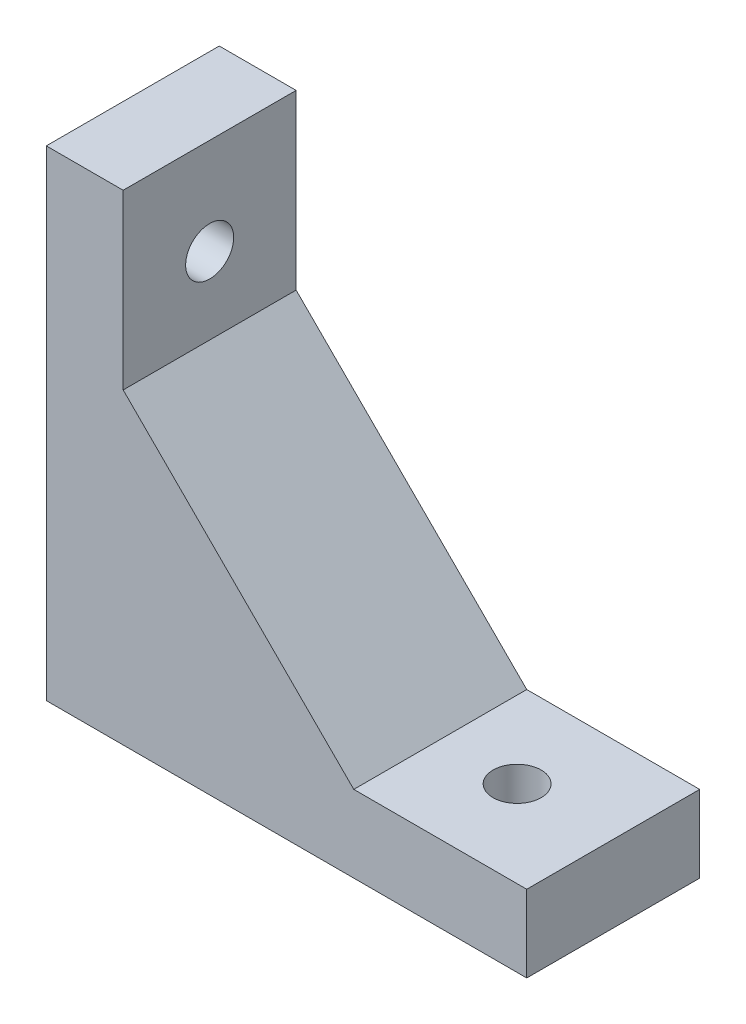
ISO-10303-21;
HEADER;
FILE_DESCRIPTION(('STEP AP214'),'2;1');
FILE_NAME('part.step','',(''),(''),'','','');
FILE_SCHEMA(('AUTOMOTIVE_DESIGN { 1 0 10303 214 1 1 1 1 }'));
ENDSEC;
DATA;
#1=APPLICATION_CONTEXT('core data for automotive mechanical design processes');
#2=APPLICATION_PROTOCOL_DEFINITION('international standard','automotive_design',2000,#1);
#3=PRODUCT_CONTEXT('',#1,'mechanical');
#4=PRODUCT('Part','Part','',(#3));
#5=PRODUCT_RELATED_PRODUCT_CATEGORY('part','',(#4));
#6=PRODUCT_DEFINITION_FORMATION('','',#4);
#7=PRODUCT_DEFINITION_CONTEXT('part definition',#1,'design');
#8=PRODUCT_DEFINITION('design','',#6,#7);
#9=PRODUCT_DEFINITION_SHAPE('','',#8);
#10=(LENGTH_UNIT() NAMED_UNIT(*) SI_UNIT(.MILLI.,.METRE.));
#11=(NAMED_UNIT(*) PLANE_ANGLE_UNIT() SI_UNIT($,.RADIAN.));
#12=(NAMED_UNIT(*) SI_UNIT($,.STERADIAN.) SOLID_ANGLE_UNIT());
#13=UNCERTAINTY_MEASURE_WITH_UNIT(LENGTH_MEASURE(1.E-05),#10,'distance_accuracy_value','');
#14=(GEOMETRIC_REPRESENTATION_CONTEXT(3) GLOBAL_UNCERTAINTY_ASSIGNED_CONTEXT((#13)) GLOBAL_UNIT_ASSIGNED_CONTEXT((#10,
#11,#12)) REPRESENTATION_CONTEXT('',''));
#15=CARTESIAN_POINT('',(0.,0.,0.));
#16=DIRECTION('',(0.,0.,1.));
#17=DIRECTION('',(1.,0.,0.));
#18=AXIS2_PLACEMENT_3D('',#15,#16,#17);
#19=CARTESIAN_POINT('',(0.,50.,18.));
#20=DIRECTION('',(1.,0.,0.));
#21=DIRECTION('',(0.,1.,0.));
#22=AXIS2_PLACEMENT_3D('',#19,#20,#21);
#23=PLANE('',#22);
#24=CARTESIAN_POINT('',(0.,40.,9.));
#25=DIRECTION('',(-1.,0.,0.));
#26=DIRECTION('',(0.,-1.,0.));
#27=AXIS2_PLACEMENT_3D('',#24,#25,#26);
#28=CIRCLE('',#27,2.5);
#29=CARTESIAN_POINT('',(0.,37.5,9.));
#30=VERTEX_POINT('',#29);
#31=EDGE_CURVE('E164',#30,#30,#28,.T.);
#32=ORIENTED_EDGE('',*,*,#31,.F.);
#33=EDGE_LOOP('',(#32));
#34=FACE_BOUND('',#33,.T.);
#35=DIRECTION('',(0.,-1.,0.));
#36=VECTOR('',#35,1.);
#37=CARTESIAN_POINT('',(0.,50.,0.));
#38=LINE('',#37,#36);
#39=CARTESIAN_POINT('',(0.,50.,0.));
#40=VERTEX_POINT('',#39);
#41=CARTESIAN_POINT('',(0.,0.,0.));
#42=VERTEX_POINT('',#41);
#43=EDGE_CURVE('E131',#40,#42,#38,.T.);
#44=ORIENTED_EDGE('',*,*,#43,.T.);
#45=DIRECTION('',(0.,0.,-1.));
#46=VECTOR('',#45,1.);
#47=CARTESIAN_POINT('',(0.,0.,18.));
#48=LINE('',#47,#46);
#49=CARTESIAN_POINT('',(0.,0.,18.));
#50=VERTEX_POINT('',#49);
#51=EDGE_CURVE('E11',#50,#42,#48,.T.);
#52=ORIENTED_EDGE('',*,*,#51,.F.);
#53=DIRECTION('',(0.,-1.,0.));
#54=VECTOR('',#53,1.);
#55=CARTESIAN_POINT('',(0.,50.,18.));
#56=LINE('',#55,#54);
#57=CARTESIAN_POINT('',(0.,50.,18.));
#58=VERTEX_POINT('',#57);
#59=EDGE_CURVE('E148',#58,#50,#56,.T.);
#60=ORIENTED_EDGE('',*,*,#59,.F.);
#61=DIRECTION('',(0.,0.,-1.));
#62=VECTOR('',#61,1.);
#63=CARTESIAN_POINT('',(0.,50.,18.));
#64=LINE('',#63,#62);
#65=EDGE_CURVE('E57',#58,#40,#64,.T.);
#66=ORIENTED_EDGE('',*,*,#65,.T.);
#67=EDGE_LOOP('',(#44,#52,#60,#66));
#68=FACE_BOUND('',#67,.T.);
#69=ADVANCED_FACE('F39',(#34,#68),#23,.F.);
#70=CARTESIAN_POINT('',(0.,0.,18.));
#71=DIRECTION('',(0.,1.,0.));
#72=DIRECTION('',(0.,0.,1.));
#73=AXIS2_PLACEMENT_3D('',#70,#71,#72);
#74=PLANE('',#73);
#75=CARTESIAN_POINT('',(40.,0.,9.));
#76=DIRECTION('',(0.,-1.,0.));
#77=DIRECTION('',(0.,0.,-1.));
#78=AXIS2_PLACEMENT_3D('',#75,#76,#77);
#79=CIRCLE('',#78,2.5);
#80=CARTESIAN_POINT('',(40.,0.,6.5));
#81=VERTEX_POINT('',#80);
#82=EDGE_CURVE('E156',#81,#81,#79,.T.);
#83=ORIENTED_EDGE('',*,*,#82,.F.);
#84=EDGE_LOOP('',(#83));
#85=FACE_BOUND('',#84,.T.);
#86=DIRECTION('',(1.,0.,0.));
#87=VECTOR('',#86,1.);
#88=CARTESIAN_POINT('',(0.,0.,0.));
#89=LINE('',#88,#87);
#90=CARTESIAN_POINT('',(50.,0.,0.));
#91=VERTEX_POINT('',#90);
#92=EDGE_CURVE('E133',#42,#91,#89,.T.);
#93=ORIENTED_EDGE('',*,*,#92,.T.);
#94=DIRECTION('',(0.,0.,-1.));
#95=VECTOR('',#94,1.);
#96=CARTESIAN_POINT('',(50.,0.,18.));
#97=LINE('',#96,#95);
#98=CARTESIAN_POINT('',(50.,0.,18.));
#99=VERTEX_POINT('',#98);
#100=EDGE_CURVE('E48',#99,#91,#97,.T.);
#101=ORIENTED_EDGE('',*,*,#100,.F.);
#102=DIRECTION('',(1.,0.,0.));
#103=VECTOR('',#102,1.);
#104=CARTESIAN_POINT('',(0.,0.,18.));
#105=LINE('',#104,#103);
#106=EDGE_CURVE('E92',#50,#99,#105,.T.);
#107=ORIENTED_EDGE('',*,*,#106,.F.);
#108=ORIENTED_EDGE('',*,*,#51,.T.);
#109=EDGE_LOOP('',(#93,#101,#107,#108));
#110=FACE_BOUND('',#109,.T.);
#111=ADVANCED_FACE('F189',(#85,#110),#74,.F.);
#112=CARTESIAN_POINT('',(50.,0.,18.));
#113=DIRECTION('',(-1.,0.,0.));
#114=DIRECTION('',(0.,0.,1.));
#115=AXIS2_PLACEMENT_3D('',#112,#113,#114);
#116=PLANE('',#115);
#117=DIRECTION('',(0.,1.,0.));
#118=VECTOR('',#117,1.);
#119=CARTESIAN_POINT('',(50.,0.,0.));
#120=LINE('',#119,#118);
#121=CARTESIAN_POINT('',(50.,8.,0.));
#122=VERTEX_POINT('',#121);
#123=EDGE_CURVE('E136',#91,#122,#120,.T.);
#124=ORIENTED_EDGE('',*,*,#123,.T.);
#125=DIRECTION('',(0.,0.,-1.));
#126=VECTOR('',#125,1.);
#127=CARTESIAN_POINT('',(50.,8.,18.));
#128=LINE('',#127,#126);
#129=CARTESIAN_POINT('',(50.,8.,18.));
#130=VERTEX_POINT('',#129);
#131=EDGE_CURVE('E152',#130,#122,#128,.T.);
#132=ORIENTED_EDGE('',*,*,#131,.F.);
#133=DIRECTION('',(0.,1.,0.));
#134=VECTOR('',#133,1.);
#135=CARTESIAN_POINT('',(50.,0.,18.));
#136=LINE('',#135,#134);
#137=EDGE_CURVE('E169',#99,#130,#136,.T.);
#138=ORIENTED_EDGE('',*,*,#137,.F.);
#139=ORIENTED_EDGE('',*,*,#100,.T.);
#140=EDGE_LOOP('',(#124,#132,#138,#139));
#141=FACE_BOUND('',#140,.T.);
#142=ADVANCED_FACE('F194',(#141),#116,.F.);
#143=CARTESIAN_POINT('',(32.,8.,18.));
#144=DIRECTION('',(0.,1.,0.));
#145=DIRECTION('',(0.,0.,1.));
#146=AXIS2_PLACEMENT_3D('',#143,#144,#145);
#147=PLANE('',#146);
#148=CARTESIAN_POINT('',(40.,8.,9.));
#149=DIRECTION('',(0.,1.,0.));
#150=DIRECTION('',(0.,0.,1.));
#151=AXIS2_PLACEMENT_3D('',#148,#149,#150);
#152=CIRCLE('',#151,2.5);
#153=CARTESIAN_POINT('',(40.,8.,11.5));
#154=VERTEX_POINT('',#153);
#155=EDGE_CURVE('E134',#154,#154,#152,.T.);
#156=ORIENTED_EDGE('',*,*,#155,.F.);
#157=EDGE_LOOP('',(#156));
#158=FACE_BOUND('',#157,.T.);
#159=DIRECTION('',(1.,0.,0.));
#160=VECTOR('',#159,1.);
#161=CARTESIAN_POINT('',(32.,8.,0.));
#162=LINE('',#161,#160);
#163=CARTESIAN_POINT('',(32.,8.,0.));
#164=VERTEX_POINT('',#163);
#165=EDGE_CURVE('E139',#164,#122,#162,.T.);
#166=ORIENTED_EDGE('',*,*,#165,.F.);
#167=DIRECTION('',(0.,0.,-1.));
#168=VECTOR('',#167,1.);
#169=CARTESIAN_POINT('',(32.,8.,18.));
#170=LINE('',#169,#168);
#171=CARTESIAN_POINT('',(32.,8.,18.));
#172=VERTEX_POINT('',#171);
#173=EDGE_CURVE('E114',#172,#164,#170,.T.);
#174=ORIENTED_EDGE('',*,*,#173,.F.);
#175=DIRECTION('',(1.,0.,0.));
#176=VECTOR('',#175,1.);
#177=CARTESIAN_POINT('',(32.,8.,18.));
#178=LINE('',#177,#176);
#179=EDGE_CURVE('E123',#172,#130,#178,.T.);
#180=ORIENTED_EDGE('',*,*,#179,.T.);
#181=ORIENTED_EDGE('',*,*,#131,.T.);
#182=EDGE_LOOP('',(#166,#174,#180,#181));
#183=FACE_BOUND('',#182,.T.);
#184=ADVANCED_FACE('F172',(#158,#183),#147,.T.);
#185=CARTESIAN_POINT('',(8.,32.0000000000001,18.));
#186=DIRECTION('',(0.707106781186549,0.707106781186546,0.));
#187=DIRECTION('',(-0.707106781186546,0.707106781186549,0.));
#188=AXIS2_PLACEMENT_3D('',#185,#186,#187);
#189=PLANE('',#188);
#190=DIRECTION('',(0.707106781186546,-0.707106781186549,0.));
#191=VECTOR('',#190,1.);
#192=CARTESIAN_POINT('',(8.,32.0000000000001,0.));
#193=LINE('',#192,#191);
#194=CARTESIAN_POINT('',(8.,32.0000000000001,0.));
#195=VERTEX_POINT('',#194);
#196=EDGE_CURVE('E110',#195,#164,#193,.T.);
#197=ORIENTED_EDGE('',*,*,#196,.F.);
#198=DIRECTION('',(0.,0.,-1.));
#199=VECTOR('',#198,1.);
#200=CARTESIAN_POINT('',(8.,32.0000000000001,18.));
#201=LINE('',#200,#199);
#202=CARTESIAN_POINT('',(8.,32.0000000000001,18.));
#203=VERTEX_POINT('',#202);
#204=EDGE_CURVE('E105',#203,#195,#201,.T.);
#205=ORIENTED_EDGE('',*,*,#204,.F.);
#206=DIRECTION('',(0.707106781186546,-0.707106781186549,0.));
#207=VECTOR('',#206,1.);
#208=CARTESIAN_POINT('',(8.,32.0000000000001,18.));
#209=LINE('',#208,#207);
#210=EDGE_CURVE('E108',#203,#172,#209,.T.);
#211=ORIENTED_EDGE('',*,*,#210,.T.);
#212=ORIENTED_EDGE('',*,*,#173,.T.);
#213=EDGE_LOOP('',(#197,#205,#211,#212));
#214=FACE_BOUND('',#213,.T.);
#215=ADVANCED_FACE('F107',(#214),#189,.T.);
#216=CARTESIAN_POINT('',(8.,50.,18.));
#217=DIRECTION('',(1.,0.,0.));
#218=DIRECTION('',(0.,1.,0.));
#219=AXIS2_PLACEMENT_3D('',#216,#217,#218);
#220=PLANE('',#219);
#221=CARTESIAN_POINT('',(8.,40.,9.));
#222=DIRECTION('',(1.,0.,0.));
#223=DIRECTION('',(0.,1.,0.));
#224=AXIS2_PLACEMENT_3D('',#221,#222,#223);
#225=CIRCLE('',#224,2.5);
#226=CARTESIAN_POINT('',(8.,42.5,9.));
#227=VERTEX_POINT('',#226);
#228=EDGE_CURVE('E42',#227,#227,#225,.T.);
#229=ORIENTED_EDGE('',*,*,#228,.F.);
#230=EDGE_LOOP('',(#229));
#231=FACE_BOUND('',#230,.T.);
#232=DIRECTION('',(0.,-1.,0.));
#233=VECTOR('',#232,1.);
#234=CARTESIAN_POINT('',(8.,50.,0.));
#235=LINE('',#234,#233);
#236=CARTESIAN_POINT('',(8.,50.,0.));
#237=VERTEX_POINT('',#236);
#238=EDGE_CURVE('E143',#237,#195,#235,.T.);
#239=ORIENTED_EDGE('',*,*,#238,.F.);
#240=DIRECTION('',(0.,0.,-1.));
#241=VECTOR('',#240,1.);
#242=CARTESIAN_POINT('',(8.,50.,18.));
#243=LINE('',#242,#241);
#244=CARTESIAN_POINT('',(8.,50.,18.));
#245=VERTEX_POINT('',#244);
#246=EDGE_CURVE('E80',#245,#237,#243,.T.);
#247=ORIENTED_EDGE('',*,*,#246,.F.);
#248=DIRECTION('',(0.,-1.,0.));
#249=VECTOR('',#248,1.);
#250=CARTESIAN_POINT('',(8.,50.,18.));
#251=LINE('',#250,#249);
#252=EDGE_CURVE('E121',#245,#203,#251,.T.);
#253=ORIENTED_EDGE('',*,*,#252,.T.);
#254=ORIENTED_EDGE('',*,*,#204,.T.);
#255=EDGE_LOOP('',(#239,#247,#253,#254));
#256=FACE_BOUND('',#255,.T.);
#257=ADVANCED_FACE('F125',(#231,#256),#220,.T.);
#258=CARTESIAN_POINT('',(0.,50.,18.));
#259=DIRECTION('',(0.,1.,0.));
#260=DIRECTION('',(0.,0.,1.));
#261=AXIS2_PLACEMENT_3D('',#258,#259,#260);
#262=PLANE('',#261);
#263=DIRECTION('',(1.,0.,0.));
#264=VECTOR('',#263,1.);
#265=CARTESIAN_POINT('',(0.,50.,0.));
#266=LINE('',#265,#264);
#267=EDGE_CURVE('E145',#40,#237,#266,.T.);
#268=ORIENTED_EDGE('',*,*,#267,.F.);
#269=ORIENTED_EDGE('',*,*,#65,.F.);
#270=DIRECTION('',(1.,0.,0.));
#271=VECTOR('',#270,1.);
#272=CARTESIAN_POINT('',(0.,50.,18.));
#273=LINE('',#272,#271);
#274=EDGE_CURVE('E126',#58,#245,#273,.T.);
#275=ORIENTED_EDGE('',*,*,#274,.T.);
#276=ORIENTED_EDGE('',*,*,#246,.T.);
#277=EDGE_LOOP('',(#268,#269,#275,#276));
#278=FACE_BOUND('',#277,.T.);
#279=ADVANCED_FACE('F177',(#278),#262,.T.);
#280=CARTESIAN_POINT('',(0.,0.,18.));
#281=DIRECTION('',(0.,0.,1.));
#282=DIRECTION('',(1.,0.,0.));
#283=AXIS2_PLACEMENT_3D('',#280,#281,#282);
#284=PLANE('',#283);
#285=ORIENTED_EDGE('',*,*,#59,.T.);
#286=ORIENTED_EDGE('',*,*,#106,.T.);
#287=ORIENTED_EDGE('',*,*,#137,.T.);
#288=ORIENTED_EDGE('',*,*,#179,.F.);
#289=ORIENTED_EDGE('',*,*,#210,.F.);
#290=ORIENTED_EDGE('',*,*,#252,.F.);
#291=ORIENTED_EDGE('',*,*,#274,.F.);
#292=EDGE_LOOP('',(#285,#286,#287,#288,#289,#290,#291));
#293=FACE_BOUND('',#292,.T.);
#294=ADVANCED_FACE('F119',(#293),#284,.T.);
#295=CARTESIAN_POINT('',(0.,0.,0.));
#296=DIRECTION('',(0.,0.,1.));
#297=DIRECTION('',(1.,0.,0.));
#298=AXIS2_PLACEMENT_3D('',#295,#296,#297);
#299=PLANE('',#298);
#300=ORIENTED_EDGE('',*,*,#43,.F.);
#301=ORIENTED_EDGE('',*,*,#267,.T.);
#302=ORIENTED_EDGE('',*,*,#238,.T.);
#303=ORIENTED_EDGE('',*,*,#196,.T.);
#304=ORIENTED_EDGE('',*,*,#165,.T.);
#305=ORIENTED_EDGE('',*,*,#123,.F.);
#306=ORIENTED_EDGE('',*,*,#92,.F.);
#307=EDGE_LOOP('',(#300,#301,#302,#303,#304,#305,#306));
#308=FACE_BOUND('',#307,.T.);
#309=ADVANCED_FACE('F176',(#308),#299,.F.);
#310=CARTESIAN_POINT('',(40.,50.,9.));
#311=DIRECTION('',(0.,-1.,0.));
#312=DIRECTION('',(0.,0.,-1.));
#313=AXIS2_PLACEMENT_3D('',#310,#311,#312);
#314=CYLINDRICAL_SURFACE('',#313,2.5);
#315=ORIENTED_EDGE('',*,*,#155,.T.);
#316=EDGE_LOOP('',(#315));
#317=FACE_BOUND('',#316,.T.);
#318=ORIENTED_EDGE('',*,*,#82,.T.);
#319=EDGE_LOOP('',(#318));
#320=FACE_BOUND('',#319,.T.);
#321=ADVANCED_FACE('F232',(#317,#320),#314,.F.);
#322=CARTESIAN_POINT('',(50.,40.,9.));
#323=DIRECTION('',(-1.,0.,0.));
#324=DIRECTION('',(0.,-1.,0.));
#325=AXIS2_PLACEMENT_3D('',#322,#323,#324);
#326=CYLINDRICAL_SURFACE('',#325,2.5);
#327=ORIENTED_EDGE('',*,*,#228,.T.);
#328=EDGE_LOOP('',(#327));
#329=FACE_BOUND('',#328,.T.);
#330=ORIENTED_EDGE('',*,*,#31,.T.);
#331=EDGE_LOOP('',(#330));
#332=FACE_BOUND('',#331,.T.);
#333=ADVANCED_FACE('F228',(#329,#332),#326,.F.);
#334=CLOSED_SHELL('',(#69,#111,#142,#184,#215,#257,#279,#294,#309,#321,#333));
#335=MANIFOLD_SOLID_BREP('B2',#334);
#336=ADVANCED_BREP_SHAPE_REPRESENTATION('',(#18,#335),#14);
#337=SHAPE_DEFINITION_REPRESENTATION(#9,#336);
ENDSEC;
END-ISO-10303-21;
